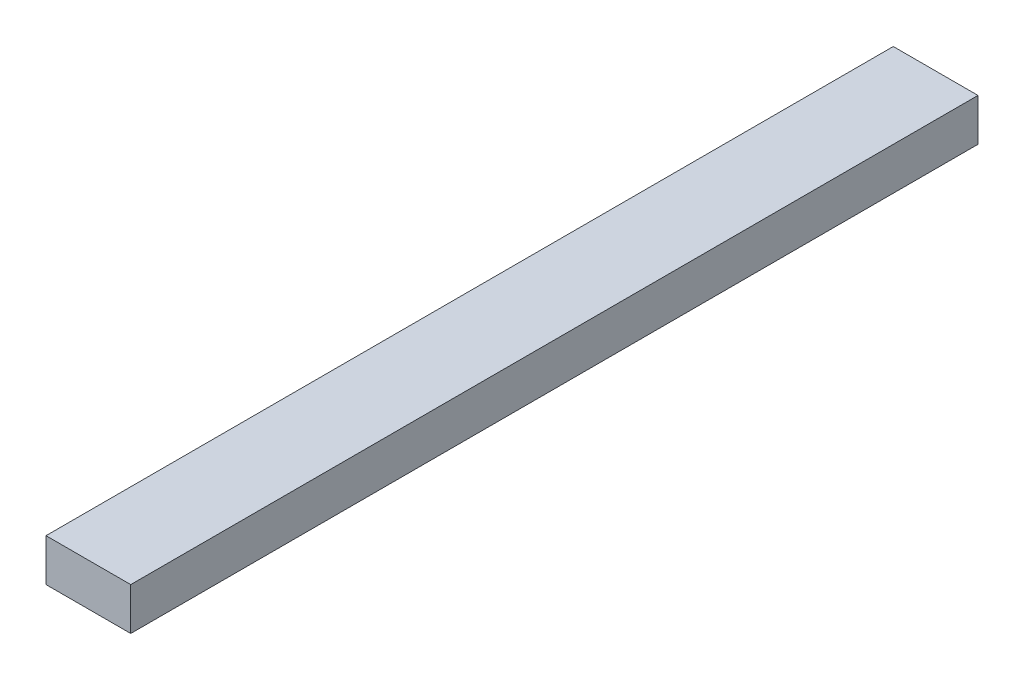
ISO-10303-21;
HEADER;
FILE_DESCRIPTION(('STEP AP214'),'2;1');
FILE_NAME('part.step','',(''),(''),'','','');
FILE_SCHEMA(('AUTOMOTIVE_DESIGN { 1 0 10303 214 1 1 1 1 }'));
ENDSEC;
DATA;
#1=APPLICATION_CONTEXT('core data for automotive mechanical design processes');
#2=APPLICATION_PROTOCOL_DEFINITION('international standard','automotive_design',2000,#1);
#3=PRODUCT_CONTEXT('',#1,'mechanical');
#4=PRODUCT('Part','Part','',(#3));
#5=PRODUCT_RELATED_PRODUCT_CATEGORY('part','',(#4));
#6=PRODUCT_DEFINITION_FORMATION('','',#4);
#7=PRODUCT_DEFINITION_CONTEXT('part definition',#1,'design');
#8=PRODUCT_DEFINITION('design','',#6,#7);
#9=PRODUCT_DEFINITION_SHAPE('','',#8);
#10=(LENGTH_UNIT() NAMED_UNIT(*) SI_UNIT(.MILLI.,.METRE.));
#11=(NAMED_UNIT(*) PLANE_ANGLE_UNIT() SI_UNIT($,.RADIAN.));
#12=(NAMED_UNIT(*) SI_UNIT($,.STERADIAN.) SOLID_ANGLE_UNIT());
#13=UNCERTAINTY_MEASURE_WITH_UNIT(LENGTH_MEASURE(1.E-05),#10,'distance_accuracy_value','');
#14=(GEOMETRIC_REPRESENTATION_CONTEXT(3) GLOBAL_UNCERTAINTY_ASSIGNED_CONTEXT((#13)) GLOBAL_UNIT_ASSIGNED_CONTEXT((#10,
#11,#12)) REPRESENTATION_CONTEXT('',''));
#15=CARTESIAN_POINT('',(0.,0.,0.));
#16=DIRECTION('',(0.,0.,1.));
#17=DIRECTION('',(1.,0.,0.));
#18=AXIS2_PLACEMENT_3D('',#15,#16,#17);
#19=CARTESIAN_POINT('',(0.,0.,25.4));
#20=DIRECTION('',(-1.,0.,0.));
#21=DIRECTION('',(0.,-1.,0.));
#22=AXIS2_PLACEMENT_3D('',#19,#20,#21);
#23=PLANE('',#22);
#24=DIRECTION('',(0.,1.,0.));
#25=VECTOR('',#24,1.);
#26=CARTESIAN_POINT('',(0.,0.,0.));
#27=LINE('',#26,#25);
#28=CARTESIAN_POINT('',(0.,0.,0.));
#29=VERTEX_POINT('',#28);
#30=CARTESIAN_POINT('',(0.,1.27,0.));
#31=VERTEX_POINT('',#30);
#32=EDGE_CURVE('E99',#29,#31,#27,.T.);
#33=ORIENTED_EDGE('',*,*,#32,.T.);
#34=DIRECTION('',(0.,0.,-1.));
#35=VECTOR('',#34,1.);
#36=CARTESIAN_POINT('',(0.,1.27,25.4));
#37=LINE('',#36,#35);
#38=CARTESIAN_POINT('',(0.,1.27,25.4));
#39=VERTEX_POINT('',#38);
#40=EDGE_CURVE('E11',#39,#31,#37,.T.);
#41=ORIENTED_EDGE('',*,*,#40,.F.);
#42=DIRECTION('',(0.,1.,0.));
#43=VECTOR('',#42,1.);
#44=CARTESIAN_POINT('',(0.,0.,25.4));
#45=LINE('',#44,#43);
#46=CARTESIAN_POINT('',(0.,0.,25.4));
#47=VERTEX_POINT('',#46);
#48=EDGE_CURVE('E87',#47,#39,#45,.T.);
#49=ORIENTED_EDGE('',*,*,#48,.F.);
#50=DIRECTION('',(0.,0.,-1.));
#51=VECTOR('',#50,1.);
#52=CARTESIAN_POINT('',(0.,0.,25.4));
#53=LINE('',#52,#51);
#54=EDGE_CURVE('E95',#47,#29,#53,.T.);
#55=ORIENTED_EDGE('',*,*,#54,.T.);
#56=EDGE_LOOP('',(#33,#41,#49,#55));
#57=FACE_BOUND('',#56,.T.);
#58=ADVANCED_FACE('F36',(#57),#23,.F.);
#59=CARTESIAN_POINT('',(0.,1.27,25.4));
#60=DIRECTION('',(0.,-1.,0.));
#61=DIRECTION('',(1.,0.,0.));
#62=AXIS2_PLACEMENT_3D('',#59,#60,#61);
#63=PLANE('',#62);
#64=DIRECTION('',(-1.,0.,0.));
#65=VECTOR('',#64,1.);
#66=CARTESIAN_POINT('',(0.,1.27,0.));
#67=LINE('',#66,#65);
#68=CARTESIAN_POINT('',(-2.54,1.27,0.));
#69=VERTEX_POINT('',#68);
#70=EDGE_CURVE('E91',#31,#69,#67,.T.);
#71=ORIENTED_EDGE('',*,*,#70,.T.);
#72=DIRECTION('',(0.,0.,-1.));
#73=VECTOR('',#72,1.);
#74=CARTESIAN_POINT('',(-2.54,1.27,25.4));
#75=LINE('',#74,#73);
#76=CARTESIAN_POINT('',(-2.54,1.27,25.4));
#77=VERTEX_POINT('',#76);
#78=EDGE_CURVE('E44',#77,#69,#75,.T.);
#79=ORIENTED_EDGE('',*,*,#78,.F.);
#80=DIRECTION('',(-1.,0.,0.));
#81=VECTOR('',#80,1.);
#82=CARTESIAN_POINT('',(0.,1.27,25.4));
#83=LINE('',#82,#81);
#84=EDGE_CURVE('E82',#39,#77,#83,.T.);
#85=ORIENTED_EDGE('',*,*,#84,.F.);
#86=ORIENTED_EDGE('',*,*,#40,.T.);
#87=EDGE_LOOP('',(#71,#79,#85,#86));
#88=FACE_BOUND('',#87,.T.);
#89=ADVANCED_FACE('F90',(#88),#63,.F.);
#90=CARTESIAN_POINT('',(-2.54,0.,25.4));
#91=DIRECTION('',(1.,0.,0.));
#92=DIRECTION('',(0.,0.,-1.));
#93=AXIS2_PLACEMENT_3D('',#90,#91,#92);
#94=PLANE('',#93);
#95=DIRECTION('',(0.,-1.,0.));
#96=VECTOR('',#95,1.);
#97=CARTESIAN_POINT('',(-2.54,0.,0.));
#98=LINE('',#97,#96);
#99=CARTESIAN_POINT('',(-2.54,0.,0.));
#100=VERTEX_POINT('',#99);
#101=EDGE_CURVE('E69',#69,#100,#98,.T.);
#102=ORIENTED_EDGE('',*,*,#101,.T.);
#103=DIRECTION('',(0.,0.,-1.));
#104=VECTOR('',#103,1.);
#105=CARTESIAN_POINT('',(-2.54,0.,25.4));
#106=LINE('',#105,#104);
#107=CARTESIAN_POINT('',(-2.54,0.,25.4));
#108=VERTEX_POINT('',#107);
#109=EDGE_CURVE('E92',#108,#100,#106,.T.);
#110=ORIENTED_EDGE('',*,*,#109,.F.);
#111=DIRECTION('',(0.,-1.,0.));
#112=VECTOR('',#111,1.);
#113=CARTESIAN_POINT('',(-2.54,0.,25.4));
#114=LINE('',#113,#112);
#115=EDGE_CURVE('E85',#77,#108,#114,.T.);
#116=ORIENTED_EDGE('',*,*,#115,.F.);
#117=ORIENTED_EDGE('',*,*,#78,.T.);
#118=EDGE_LOOP('',(#102,#110,#116,#117));
#119=FACE_BOUND('',#118,.T.);
#120=ADVANCED_FACE('F93',(#119),#94,.F.);
#121=CARTESIAN_POINT('',(0.,0.,25.4));
#122=DIRECTION('',(0.,1.,0.));
#123=DIRECTION('',(0.,0.,1.));
#124=AXIS2_PLACEMENT_3D('',#121,#122,#123);
#125=PLANE('',#124);
#126=DIRECTION('',(1.,0.,0.));
#127=VECTOR('',#126,1.);
#128=CARTESIAN_POINT('',(0.,0.,0.));
#129=LINE('',#128,#127);
#130=EDGE_CURVE('E75',#100,#29,#129,.T.);
#131=ORIENTED_EDGE('',*,*,#130,.T.);
#132=ORIENTED_EDGE('',*,*,#54,.F.);
#133=DIRECTION('',(1.,0.,0.));
#134=VECTOR('',#133,1.);
#135=CARTESIAN_POINT('',(0.,0.,25.4));
#136=LINE('',#135,#134);
#137=EDGE_CURVE('E52',#108,#47,#136,.T.);
#138=ORIENTED_EDGE('',*,*,#137,.F.);
#139=ORIENTED_EDGE('',*,*,#109,.T.);
#140=EDGE_LOOP('',(#131,#132,#138,#139));
#141=FACE_BOUND('',#140,.T.);
#142=ADVANCED_FACE('F106',(#141),#125,.F.);
#143=CARTESIAN_POINT('',(0.,0.,25.4));
#144=DIRECTION('',(0.,0.,1.));
#145=DIRECTION('',(1.,0.,0.));
#146=AXIS2_PLACEMENT_3D('',#143,#144,#145);
#147=PLANE('',#146);
#148=ORIENTED_EDGE('',*,*,#48,.T.);
#149=ORIENTED_EDGE('',*,*,#84,.T.);
#150=ORIENTED_EDGE('',*,*,#115,.T.);
#151=ORIENTED_EDGE('',*,*,#137,.T.);
#152=EDGE_LOOP('',(#148,#149,#150,#151));
#153=FACE_BOUND('',#152,.T.);
#154=ADVANCED_FACE('F83',(#153),#147,.T.);
#155=CARTESIAN_POINT('',(0.,0.,0.));
#156=DIRECTION('',(0.,0.,1.));
#157=DIRECTION('',(1.,0.,0.));
#158=AXIS2_PLACEMENT_3D('',#155,#156,#157);
#159=PLANE('',#158);
#160=ORIENTED_EDGE('',*,*,#32,.F.);
#161=ORIENTED_EDGE('',*,*,#130,.F.);
#162=ORIENTED_EDGE('',*,*,#101,.F.);
#163=ORIENTED_EDGE('',*,*,#70,.F.);
#164=EDGE_LOOP('',(#160,#161,#162,#163));
#165=FACE_BOUND('',#164,.T.);
#166=ADVANCED_FACE('F109',(#165),#159,.F.);
#167=CLOSED_SHELL('',(#58,#89,#120,#142,#154,#166));
#168=MANIFOLD_SOLID_BREP('B2',#167);
#169=ADVANCED_BREP_SHAPE_REPRESENTATION('',(#18,#168),#14);
#170=SHAPE_DEFINITION_REPRESENTATION(#9,#169);
ENDSEC;
END-ISO-10303-21;
